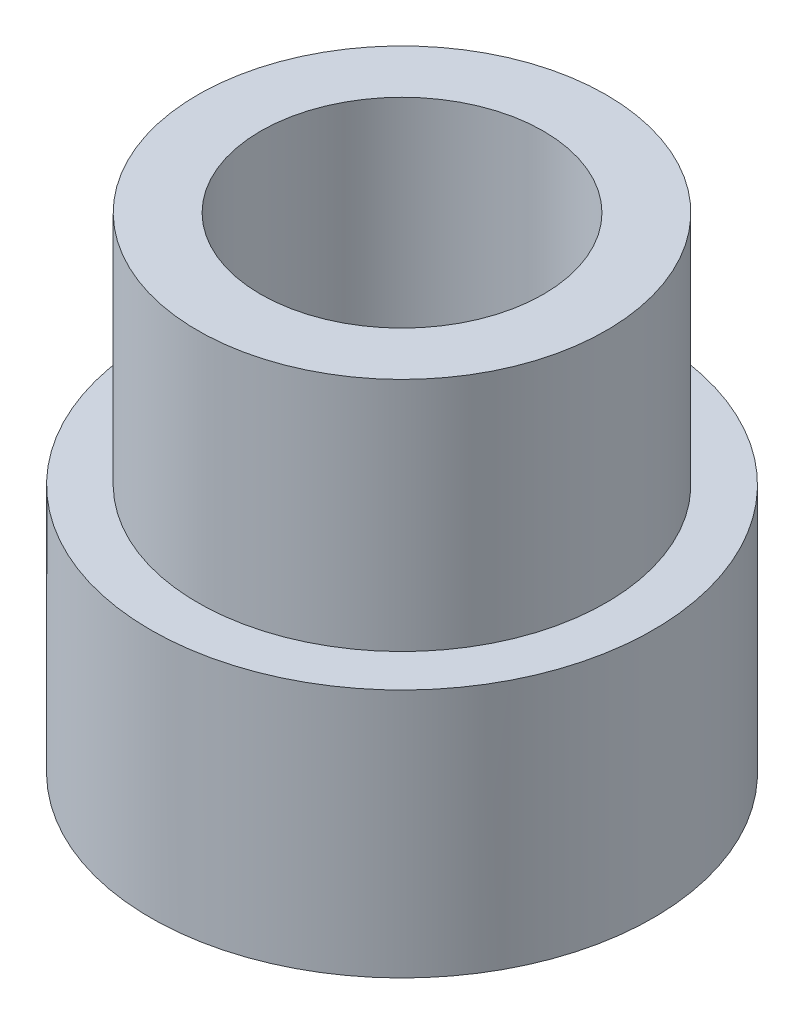
ISO-10303-21;
HEADER;
FILE_DESCRIPTION(('STEP AP214'),'2;1');
FILE_NAME('part.step','',(''),(''),'','','');
FILE_SCHEMA(('AUTOMOTIVE_DESIGN { 1 0 10303 214 1 1 1 1 }'));
ENDSEC;
DATA;
#1=APPLICATION_CONTEXT('core data for automotive mechanical design processes');
#2=APPLICATION_PROTOCOL_DEFINITION('international standard','automotive_design',2000,#1);
#3=PRODUCT_CONTEXT('',#1,'mechanical');
#4=PRODUCT('Part','Part','',(#3));
#5=PRODUCT_RELATED_PRODUCT_CATEGORY('part','',(#4));
#6=PRODUCT_DEFINITION_FORMATION('','',#4);
#7=PRODUCT_DEFINITION_CONTEXT('part definition',#1,'design');
#8=PRODUCT_DEFINITION('design','',#6,#7);
#9=PRODUCT_DEFINITION_SHAPE('','',#8);
#10=(LENGTH_UNIT() NAMED_UNIT(*) SI_UNIT(.MILLI.,.METRE.));
#11=(NAMED_UNIT(*) PLANE_ANGLE_UNIT() SI_UNIT($,.RADIAN.));
#12=(NAMED_UNIT(*) SI_UNIT($,.STERADIAN.) SOLID_ANGLE_UNIT());
#13=UNCERTAINTY_MEASURE_WITH_UNIT(LENGTH_MEASURE(1.E-05),#10,'distance_accuracy_value','');
#14=(GEOMETRIC_REPRESENTATION_CONTEXT(3) GLOBAL_UNCERTAINTY_ASSIGNED_CONTEXT((#13)) GLOBAL_UNIT_ASSIGNED_CONTEXT((#10,
#11,#12)) REPRESENTATION_CONTEXT('',''));
#15=CARTESIAN_POINT('',(0.,0.,0.));
#16=DIRECTION('',(0.,0.,1.));
#17=DIRECTION('',(1.,0.,0.));
#18=AXIS2_PLACEMENT_3D('',#15,#16,#17);
#19=CARTESIAN_POINT('',(0.,10.,0.));
#20=DIRECTION('',(0.,-1.,0.));
#21=DIRECTION('',(0.,0.,-1.));
#22=AXIS2_PLACEMENT_3D('',#19,#20,#21);
#23=CYLINDRICAL_SURFACE('',#22,4.6355);
#24=CARTESIAN_POINT('',(0.,-2.,0.));
#25=DIRECTION('',(0.,1.,0.));
#26=DIRECTION('',(0.,0.,1.));
#27=AXIS2_PLACEMENT_3D('',#24,#25,#26);
#28=CIRCLE('',#27,4.6355);
#29=CARTESIAN_POINT('',(0.,-2.,4.6355));
#30=VERTEX_POINT('',#29);
#31=EDGE_CURVE('E50',#30,#30,#28,.T.);
#32=ORIENTED_EDGE('',*,*,#31,.T.);
#33=EDGE_LOOP('',(#32));
#34=FACE_BOUND('',#33,.T.);
#35=CARTESIAN_POINT('',(0.,-2.91,0.));
#36=DIRECTION('',(0.,-1.,0.));
#37=DIRECTION('',(0.,0.,-1.));
#38=AXIS2_PLACEMENT_3D('',#35,#36,#37);
#39=CIRCLE('',#38,4.6355);
#40=CARTESIAN_POINT('',(0.,-2.91,-4.6355));
#41=VERTEX_POINT('',#40);
#42=EDGE_CURVE('E37',#41,#41,#39,.T.);
#43=ORIENTED_EDGE('',*,*,#42,.T.);
#44=EDGE_LOOP('',(#43));
#45=FACE_BOUND('',#44,.T.);
#46=ADVANCED_FACE('F33',(#34,#45),#23,.F.);
#47=CARTESIAN_POINT('',(0.,10.,0.));
#48=DIRECTION('',(0.,1.,0.));
#49=DIRECTION('',(0.,0.,1.));
#50=AXIS2_PLACEMENT_3D('',#47,#48,#49);
#51=PLANE('',#50);
#52=CARTESIAN_POINT('',(0.,10.,0.));
#53=DIRECTION('',(0.,1.,0.));
#54=DIRECTION('',(0.,0.,1.));
#55=AXIS2_PLACEMENT_3D('',#52,#53,#54);
#56=CIRCLE('',#55,16.51);
#57=CARTESIAN_POINT('',(0.,10.,-16.51));
#58=VERTEX_POINT('',#57);
#59=EDGE_CURVE('E10',#58,#58,#56,.T.);
#60=ORIENTED_EDGE('',*,*,#59,.F.);
#61=EDGE_LOOP('',(#60));
#62=FACE_BOUND('',#61,.T.);
#63=CARTESIAN_POINT('',(0.,10.,0.));
#64=DIRECTION('',(0.,1.,0.));
#65=DIRECTION('',(0.,0.,1.));
#66=AXIS2_PLACEMENT_3D('',#63,#64,#65);
#67=CIRCLE('',#66,20.32);
#68=CARTESIAN_POINT('',(0.,10.,20.32));
#69=VERTEX_POINT('',#68);
#70=EDGE_CURVE('E41',#69,#69,#67,.T.);
#71=ORIENTED_EDGE('',*,*,#70,.T.);
#72=EDGE_LOOP('',(#71));
#73=FACE_BOUND('',#72,.T.);
#74=ADVANCED_FACE('F90',(#62,#73),#51,.T.);
#75=CARTESIAN_POINT('',(0.,10.,0.));
#76=DIRECTION('',(0.,-1.,0.));
#77=DIRECTION('',(0.,0.,-1.));
#78=AXIS2_PLACEMENT_3D('',#75,#76,#77);
#79=CYLINDRICAL_SURFACE('',#78,20.32);
#80=ORIENTED_EDGE('',*,*,#70,.F.);
#81=EDGE_LOOP('',(#80));
#82=FACE_BOUND('',#81,.T.);
#83=CARTESIAN_POINT('',(0.,-10.16,0.));
#84=DIRECTION('',(0.,-1.,0.));
#85=DIRECTION('',(0.,0.,-1.));
#86=AXIS2_PLACEMENT_3D('',#83,#84,#85);
#87=CIRCLE('',#86,20.32);
#88=CARTESIAN_POINT('',(0.,-10.16,-20.32));
#89=VERTEX_POINT('',#88);
#90=EDGE_CURVE('E52',#89,#89,#87,.T.);
#91=ORIENTED_EDGE('',*,*,#90,.F.);
#92=EDGE_LOOP('',(#91));
#93=FACE_BOUND('',#92,.T.);
#94=ADVANCED_FACE('F35',(#82,#93),#79,.T.);
#95=CARTESIAN_POINT('',(0.,29.05,0.));
#96=DIRECTION('',(0.,1.,0.));
#97=DIRECTION('',(0.,0.,1.));
#98=AXIS2_PLACEMENT_3D('',#95,#96,#97);
#99=PLANE('',#98);
#100=CARTESIAN_POINT('',(0.,29.05,0.));
#101=DIRECTION('',(0.,1.,0.));
#102=DIRECTION('',(0.,0.,1.));
#103=AXIS2_PLACEMENT_3D('',#100,#101,#102);
#104=CIRCLE('',#103,16.51);
#105=CARTESIAN_POINT('',(0.,29.05,-16.51));
#106=VERTEX_POINT('',#105);
#107=EDGE_CURVE('E46',#106,#106,#104,.T.);
#108=ORIENTED_EDGE('',*,*,#107,.T.);
#109=EDGE_LOOP('',(#108));
#110=FACE_BOUND('',#109,.T.);
#111=CARTESIAN_POINT('',(0.,29.05,0.));
#112=DIRECTION('',(0.,1.,0.));
#113=DIRECTION('',(0.,0.,1.));
#114=AXIS2_PLACEMENT_3D('',#111,#112,#113);
#115=CIRCLE('',#114,11.43);
#116=CARTESIAN_POINT('',(0.,29.05,-11.43));
#117=VERTEX_POINT('',#116);
#118=EDGE_CURVE('E57',#117,#117,#115,.T.);
#119=ORIENTED_EDGE('',*,*,#118,.F.);
#120=EDGE_LOOP('',(#119));
#121=FACE_BOUND('',#120,.T.);
#122=ADVANCED_FACE('F74',(#110,#121),#99,.T.);
#123=CARTESIAN_POINT('',(0.,29.05,0.));
#124=DIRECTION('',(0.,-1.,0.));
#125=DIRECTION('',(0.,0.,-1.));
#126=AXIS2_PLACEMENT_3D('',#123,#124,#125);
#127=CYLINDRICAL_SURFACE('',#126,16.51);
#128=CARTESIAN_POINT('',(0.,29.05,-16.51));
#129=CARTESIAN_POINT('',(0.,28.8515625,-16.51));
#130=CARTESIAN_POINT('',(0.,28.653125,-16.51));
#131=CARTESIAN_POINT('',(0.,28.25625,-16.51));
#132=CARTESIAN_POINT('',(0.,28.0578125,-16.51));
#133=CARTESIAN_POINT('',(0.,27.6609375,-16.51));
#134=CARTESIAN_POINT('',(0.,27.4625,-16.51));
#135=CARTESIAN_POINT('',(0.,27.065625,-16.51));
#136=CARTESIAN_POINT('',(0.,26.8671875,-16.51));
#137=CARTESIAN_POINT('',(0.,26.4703125,-16.51));
#138=CARTESIAN_POINT('',(0.,26.271875,-16.51));
#139=CARTESIAN_POINT('',(0.,25.875,-16.51));
#140=CARTESIAN_POINT('',(0.,25.6765625,-16.51));
#141=CARTESIAN_POINT('',(0.,25.2796875,-16.51));
#142=CARTESIAN_POINT('',(0.,25.08125,-16.51));
#143=CARTESIAN_POINT('',(0.,24.684375,-16.51));
#144=CARTESIAN_POINT('',(0.,24.4859375,-16.51));
#145=CARTESIAN_POINT('',(0.,24.0890625,-16.51));
#146=CARTESIAN_POINT('',(0.,23.890625,-16.51));
#147=CARTESIAN_POINT('',(0.,23.49375,-16.51));
#148=CARTESIAN_POINT('',(0.,23.2953125,-16.51));
#149=CARTESIAN_POINT('',(0.,22.8984375,-16.51));
#150=CARTESIAN_POINT('',(0.,22.7,-16.51));
#151=CARTESIAN_POINT('',(0.,22.303125,-16.51));
#152=CARTESIAN_POINT('',(0.,22.1046875,-16.51));
#153=CARTESIAN_POINT('',(0.,21.7078125,-16.51));
#154=CARTESIAN_POINT('',(0.,21.509375,-16.51));
#155=CARTESIAN_POINT('',(0.,21.1125,-16.51));
#156=CARTESIAN_POINT('',(0.,20.9140625,-16.51));
#157=CARTESIAN_POINT('',(0.,20.5171875,-16.51));
#158=CARTESIAN_POINT('',(0.,20.31875,-16.51));
#159=CARTESIAN_POINT('',(0.,19.921875,-16.51));
#160=CARTESIAN_POINT('',(0.,19.7234375,-16.51));
#161=CARTESIAN_POINT('',(0.,19.3265625,-16.51));
#162=CARTESIAN_POINT('',(0.,19.128125,-16.51));
#163=CARTESIAN_POINT('',(0.,18.73125,-16.51));
#164=CARTESIAN_POINT('',(0.,18.5328125,-16.51));
#165=CARTESIAN_POINT('',(0.,18.1359375,-16.51));
#166=CARTESIAN_POINT('',(0.,17.9375,-16.51));
#167=CARTESIAN_POINT('',(0.,17.540625,-16.51));
#168=CARTESIAN_POINT('',(0.,17.3421875,-16.51));
#169=CARTESIAN_POINT('',(0.,16.9453125,-16.51));
#170=CARTESIAN_POINT('',(0.,16.746875,-16.51));
#171=CARTESIAN_POINT('',(0.,16.35,-16.51));
#172=CARTESIAN_POINT('',(0.,16.1515625,-16.51));
#173=CARTESIAN_POINT('',(0.,15.7546875,-16.51));
#174=CARTESIAN_POINT('',(0.,15.55625,-16.51));
#175=CARTESIAN_POINT('',(0.,15.159375,-16.51));
#176=CARTESIAN_POINT('',(0.,14.9609375,-16.51));
#177=CARTESIAN_POINT('',(0.,14.5640625,-16.51));
#178=CARTESIAN_POINT('',(0.,14.365625,-16.51));
#179=CARTESIAN_POINT('',(0.,13.96875,-16.51));
#180=CARTESIAN_POINT('',(0.,13.7703125,-16.51));
#181=CARTESIAN_POINT('',(0.,13.3734375,-16.51));
#182=CARTESIAN_POINT('',(0.,13.175,-16.51));
#183=CARTESIAN_POINT('',(0.,12.778125,-16.51));
#184=CARTESIAN_POINT('',(0.,12.5796875,-16.51));
#185=CARTESIAN_POINT('',(0.,12.1828125,-16.51));
#186=CARTESIAN_POINT('',(0.,11.984375,-16.51));
#187=CARTESIAN_POINT('',(0.,11.5875,-16.51));
#188=CARTESIAN_POINT('',(0.,11.3890625,-16.51));
#189=CARTESIAN_POINT('',(0.,10.9921875,-16.51));
#190=CARTESIAN_POINT('',(0.,10.79375,-16.51));
#191=CARTESIAN_POINT('',(0.,10.396875,-16.51));
#192=CARTESIAN_POINT('',(0.,10.1984375,-16.51));
#193=CARTESIAN_POINT('',(0.,10.,-16.51));
#194=B_SPLINE_CURVE_WITH_KNOTS('',3,(#128,#129,#130,#131,#132,#133,#134,#135,#136,#137,#138,
#139,#140,#141,#142,#143,#144,#145,#146,#147,#148,#149,#150,#151,#152,#153,#154,#155,#156,#157,
#158,#159,#160,#161,#162,#163,#164,#165,#166,#167,#168,#169,#170,#171,#172,#173,#174,#175,#176,
#177,#178,#179,#180,#181,#182,#183,#184,#185,#186,#187,#188,#189,#190,#191,#192,#193),
.UNSPECIFIED.,.F.,.F.,(4,2,2,2,2,2,2,2,2,2,2,2,2,2,2,2,2,2,2,2,2,2,2,2,2,2,2,2,2,2,2,2,4),(0.,
0.595312499999997,1.190625,1.7859375,2.38125,2.9765625,3.571875,4.1671875,4.7625,5.3578125,
5.953125,6.5484375,7.14375,7.7390625,8.33437499999999,8.92968749999999,9.525,10.1203125,
10.715625,11.3109375,11.90625,12.5015625,13.096875,13.6921875,14.2875,14.8828125,15.478125,
16.0734375,16.66875,17.2640625,17.859375,18.4546875,19.05),.UNSPECIFIED.);
#195=EDGE_CURVE('BSEAM77',#106,#58,#194,.T.);
#196=ORIENTED_EDGE('',*,*,#107,.F.);
#197=ORIENTED_EDGE('',*,*,#59,.T.);
#198=ORIENTED_EDGE('',*,*,#195,.T.);
#199=ORIENTED_EDGE('',*,*,#195,.F.);
#200=EDGE_LOOP('',(#196,#198,#197,#199));
#201=FACE_BOUND('',#200,.T.);
#202=ADVANCED_FACE('F77',(#201),#127,.T.);
#203=CARTESIAN_POINT('',(0.,29.05,0.));
#204=DIRECTION('',(0.,-1.,0.));
#205=DIRECTION('',(0.,0.,-1.));
#206=AXIS2_PLACEMENT_3D('',#203,#204,#205);
#207=CYLINDRICAL_SURFACE('',#206,11.43);
#208=CARTESIAN_POINT('',(0.,-2.,0.));
#209=DIRECTION('',(0.,1.,0.));
#210=DIRECTION('',(0.,0.,1.));
#211=AXIS2_PLACEMENT_3D('',#208,#209,#210);
#212=CIRCLE('',#211,11.43);
#213=CARTESIAN_POINT('',(0.,-2.,-11.43));
#214=VERTEX_POINT('',#213);
#215=EDGE_CURVE('E53',#214,#214,#212,.T.);
#216=CARTESIAN_POINT('',(0.,29.05,-11.43));
#217=CARTESIAN_POINT('',(0.,28.7265625,-11.43));
#218=CARTESIAN_POINT('',(0.,28.403125,-11.43));
#219=CARTESIAN_POINT('',(0.,27.75625,-11.43));
#220=CARTESIAN_POINT('',(0.,27.4328125,-11.43));
#221=CARTESIAN_POINT('',(0.,26.7859375,-11.43));
#222=CARTESIAN_POINT('',(0.,26.4625,-11.43));
#223=CARTESIAN_POINT('',(0.,25.815625,-11.43));
#224=CARTESIAN_POINT('',(0.,25.4921875,-11.43));
#225=CARTESIAN_POINT('',(0.,24.8453125,-11.43));
#226=CARTESIAN_POINT('',(0.,24.521875,-11.43));
#227=CARTESIAN_POINT('',(0.,23.875,-11.43));
#228=CARTESIAN_POINT('',(0.,23.5515625,-11.43));
#229=CARTESIAN_POINT('',(0.,22.9046875,-11.43));
#230=CARTESIAN_POINT('',(0.,22.58125,-11.43));
#231=CARTESIAN_POINT('',(0.,21.934375,-11.43));
#232=CARTESIAN_POINT('',(0.,21.6109375,-11.43));
#233=CARTESIAN_POINT('',(0.,20.9640625,-11.43));
#234=CARTESIAN_POINT('',(0.,20.640625,-11.43));
#235=CARTESIAN_POINT('',(0.,19.99375,-11.43));
#236=CARTESIAN_POINT('',(0.,19.6703125,-11.43));
#237=CARTESIAN_POINT('',(0.,19.0234375,-11.43));
#238=CARTESIAN_POINT('',(0.,18.7,-11.43));
#239=CARTESIAN_POINT('',(0.,18.053125,-11.43));
#240=CARTESIAN_POINT('',(0.,17.7296875,-11.43));
#241=CARTESIAN_POINT('',(0.,17.0828125,-11.43));
#242=CARTESIAN_POINT('',(0.,16.759375,-11.43));
#243=CARTESIAN_POINT('',(0.,16.1125,-11.43));
#244=CARTESIAN_POINT('',(0.,15.7890625,-11.43));
#245=CARTESIAN_POINT('',(0.,15.1421875,-11.43));
#246=CARTESIAN_POINT('',(0.,14.81875,-11.43));
#247=CARTESIAN_POINT('',(0.,14.171875,-11.43));
#248=CARTESIAN_POINT('',(0.,13.8484375,-11.43));
#249=CARTESIAN_POINT('',(0.,13.2015625,-11.43));
#250=CARTESIAN_POINT('',(0.,12.878125,-11.43));
#251=CARTESIAN_POINT('',(0.,12.23125,-11.43));
#252=CARTESIAN_POINT('',(0.,11.9078125,-11.43));
#253=CARTESIAN_POINT('',(0.,11.2609375,-11.43));
#254=CARTESIAN_POINT('',(0.,10.9375,-11.43));
#255=CARTESIAN_POINT('',(0.,10.290625,-11.43));
#256=CARTESIAN_POINT('',(0.,9.9671875,-11.43));
#257=CARTESIAN_POINT('',(0.,9.3203125,-11.43));
#258=CARTESIAN_POINT('',(0.,8.996875,-11.43));
#259=CARTESIAN_POINT('',(0.,8.35,-11.43));
#260=CARTESIAN_POINT('',(0.,8.0265625,-11.43));
#261=CARTESIAN_POINT('',(0.,7.3796875,-11.43));
#262=CARTESIAN_POINT('',(0.,7.05625,-11.43));
#263=CARTESIAN_POINT('',(0.,6.409375,-11.43));
#264=CARTESIAN_POINT('',(0.,6.0859375,-11.43));
#265=CARTESIAN_POINT('',(0.,5.4390625,-11.43));
#266=CARTESIAN_POINT('',(0.,5.115625,-11.43));
#267=CARTESIAN_POINT('',(0.,4.46875,-11.43));
#268=CARTESIAN_POINT('',(0.,4.1453125,-11.43));
#269=CARTESIAN_POINT('',(0.,3.4984375,-11.43));
#270=CARTESIAN_POINT('',(0.,3.175,-11.43));
#271=CARTESIAN_POINT('',(0.,2.528125,-11.43));
#272=CARTESIAN_POINT('',(0.,2.2046875,-11.43));
#273=CARTESIAN_POINT('',(0.,1.5578125,-11.43));
#274=CARTESIAN_POINT('',(0.,1.234375,-11.43));
#275=CARTESIAN_POINT('',(0.,0.587500000000001,-11.43));
#276=CARTESIAN_POINT('',(0.,0.264062500000002,-11.43));
#277=CARTESIAN_POINT('',(0.,-0.382812499999997,-11.43));
#278=CARTESIAN_POINT('',(0.,-0.706249999999997,-11.43));
#279=CARTESIAN_POINT('',(0.,-1.353125,-11.43));
#280=CARTESIAN_POINT('',(0.,-1.6765625,-11.43));
#281=CARTESIAN_POINT('',(0.,-2.,-11.43));
#282=B_SPLINE_CURVE_WITH_KNOTS('',3,(#216,#217,#218,#219,#220,#221,#222,#223,#224,#225,#226,
#227,#228,#229,#230,#231,#232,#233,#234,#235,#236,#237,#238,#239,#240,#241,#242,#243,#244,#245,
#246,#247,#248,#249,#250,#251,#252,#253,#254,#255,#256,#257,#258,#259,#260,#261,#262,#263,#264,
#265,#266,#267,#268,#269,#270,#271,#272,#273,#274,#275,#276,#277,#278,#279,#280,#281),
.UNSPECIFIED.,.F.,.F.,(4,2,2,2,2,2,2,2,2,2,2,2,2,2,2,2,2,2,2,2,2,2,2,2,2,2,2,2,2,2,2,2,4),(0.,
0.970312500000001,1.940625,2.9109375,3.88125,4.8515625,5.821875,6.7921875,7.7625,8.7328125,
9.703125,10.6734375,11.64375,12.6140625,13.584375,14.5546875,15.525,16.4953125,17.465625,
18.4359375,19.40625,20.3765625,21.346875,22.3171875,23.2875,24.2578125,25.228125,26.1984375,
27.16875,28.1390625,29.109375,30.0796875,31.05),.UNSPECIFIED.);
#283=EDGE_CURVE('BSEAM79',#117,#214,#282,.T.);
#284=ORIENTED_EDGE('',*,*,#118,.T.);
#285=ORIENTED_EDGE('',*,*,#215,.F.);
#286=ORIENTED_EDGE('',*,*,#283,.T.);
#287=ORIENTED_EDGE('',*,*,#283,.F.);
#288=EDGE_LOOP('',(#284,#286,#285,#287));
#289=FACE_BOUND('',#288,.T.);
#290=ADVANCED_FACE('F79',(#289),#207,.F.);
#291=CARTESIAN_POINT('',(0.,-10.16,0.));
#292=DIRECTION('',(0.,-1.,0.));
#293=DIRECTION('',(0.,0.,-1.));
#294=AXIS2_PLACEMENT_3D('',#291,#292,#293);
#295=PLANE('',#294);
#296=CARTESIAN_POINT('',(0.,-10.16,0.));
#297=DIRECTION('',(0.,-1.,0.));
#298=DIRECTION('',(0.,0.,-1.));
#299=AXIS2_PLACEMENT_3D('',#296,#297,#298);
#300=CIRCLE('',#299,11.25);
#301=CARTESIAN_POINT('',(0.,-10.16,-11.25));
#302=VERTEX_POINT('',#301);
#303=EDGE_CURVE('E65',#302,#302,#300,.T.);
#304=ORIENTED_EDGE('',*,*,#303,.F.);
#305=EDGE_LOOP('',(#304));
#306=FACE_BOUND('',#305,.T.);
#307=ORIENTED_EDGE('',*,*,#90,.T.);
#308=EDGE_LOOP('',(#307));
#309=FACE_BOUND('',#308,.T.);
#310=ADVANCED_FACE('F85',(#306,#309),#295,.T.);
#311=CARTESIAN_POINT('',(0.,-2.,0.));
#312=DIRECTION('',(0.,1.,0.));
#313=DIRECTION('',(0.,0.,1.));
#314=AXIS2_PLACEMENT_3D('',#311,#312,#313);
#315=PLANE('',#314);
#316=ORIENTED_EDGE('',*,*,#31,.F.);
#317=EDGE_LOOP('',(#316));
#318=FACE_BOUND('',#317,.T.);
#319=ORIENTED_EDGE('',*,*,#215,.T.);
#320=EDGE_LOOP('',(#319));
#321=FACE_BOUND('',#320,.T.);
#322=ADVANCED_FACE('F121',(#318,#321),#315,.T.);
#323=CARTESIAN_POINT('',(0.,-3.66,0.));
#324=DIRECTION('',(0.,-1.,0.));
#325=DIRECTION('',(0.,0.,-1.));
#326=AXIS2_PLACEMENT_3D('',#323,#324,#325);
#327=CYLINDRICAL_SURFACE('',#326,11.25);
#328=CARTESIAN_POINT('',(0.,-3.66,0.));
#329=DIRECTION('',(0.,-1.,0.));
#330=DIRECTION('',(0.,0.,-1.));
#331=AXIS2_PLACEMENT_3D('',#328,#329,#330);
#332=CIRCLE('',#331,11.25);
#333=CARTESIAN_POINT('',(0.,-3.66,-11.25));
#334=VERTEX_POINT('',#333);
#335=EDGE_CURVE('E60',#334,#334,#332,.T.);
#336=CARTESIAN_POINT('',(0.,-3.66,-11.25));
#337=CARTESIAN_POINT('',(0.,-3.72770833333333,-11.25));
#338=CARTESIAN_POINT('',(0.,-3.79541666666667,-11.25));
#339=CARTESIAN_POINT('',(0.,-3.93083333333333,-11.25));
#340=CARTESIAN_POINT('',(0.,-3.99854166666667,-11.25));
#341=CARTESIAN_POINT('',(0.,-4.13395833333333,-11.25));
#342=CARTESIAN_POINT('',(0.,-4.20166666666667,-11.25));
#343=CARTESIAN_POINT('',(0.,-4.33708333333333,-11.25));
#344=CARTESIAN_POINT('',(0.,-4.40479166666667,-11.25));
#345=CARTESIAN_POINT('',(0.,-4.54020833333333,-11.25));
#346=CARTESIAN_POINT('',(0.,-4.60791666666667,-11.25));
#347=CARTESIAN_POINT('',(0.,-4.74333333333333,-11.25));
#348=CARTESIAN_POINT('',(0.,-4.81104166666667,-11.25));
#349=CARTESIAN_POINT('',(0.,-4.94645833333333,-11.25));
#350=CARTESIAN_POINT('',(0.,-5.01416666666667,-11.25));
#351=CARTESIAN_POINT('',(0.,-5.14958333333333,-11.25));
#352=CARTESIAN_POINT('',(0.,-5.21729166666667,-11.25));
#353=CARTESIAN_POINT('',(0.,-5.35270833333333,-11.25));
#354=CARTESIAN_POINT('',(0.,-5.42041666666667,-11.25));
#355=CARTESIAN_POINT('',(0.,-5.55583333333333,-11.25));
#356=CARTESIAN_POINT('',(0.,-5.62354166666667,-11.25));
#357=CARTESIAN_POINT('',(0.,-5.75895833333333,-11.25));
#358=CARTESIAN_POINT('',(0.,-5.82666666666667,-11.25));
#359=CARTESIAN_POINT('',(0.,-5.96208333333333,-11.25));
#360=CARTESIAN_POINT('',(0.,-6.02979166666667,-11.25));
#361=CARTESIAN_POINT('',(0.,-6.16520833333333,-11.25));
#362=CARTESIAN_POINT('',(0.,-6.23291666666667,-11.25));
#363=CARTESIAN_POINT('',(0.,-6.36833333333333,-11.25));
#364=CARTESIAN_POINT('',(0.,-6.43604166666667,-11.25));
#365=CARTESIAN_POINT('',(0.,-6.57145833333333,-11.25));
#366=CARTESIAN_POINT('',(0.,-6.63916666666667,-11.25));
#367=CARTESIAN_POINT('',(0.,-6.77458333333333,-11.25));
#368=CARTESIAN_POINT('',(0.,-6.84229166666667,-11.25));
#369=CARTESIAN_POINT('',(0.,-6.97770833333333,-11.25));
#370=CARTESIAN_POINT('',(0.,-7.04541666666667,-11.25));
#371=CARTESIAN_POINT('',(0.,-7.18083333333333,-11.25));
#372=CARTESIAN_POINT('',(0.,-7.24854166666667,-11.25));
#373=CARTESIAN_POINT('',(0.,-7.38395833333333,-11.25));
#374=CARTESIAN_POINT('',(0.,-7.45166666666667,-11.25));
#375=CARTESIAN_POINT('',(0.,-7.58708333333333,-11.25));
#376=CARTESIAN_POINT('',(0.,-7.65479166666667,-11.25));
#377=CARTESIAN_POINT('',(0.,-7.79020833333333,-11.25));
#378=CARTESIAN_POINT('',(0.,-7.85791666666667,-11.25));
#379=CARTESIAN_POINT('',(0.,-7.99333333333333,-11.25));
#380=CARTESIAN_POINT('',(0.,-8.06104166666667,-11.25));
#381=CARTESIAN_POINT('',(0.,-8.19645833333333,-11.25));
#382=CARTESIAN_POINT('',(0.,-8.26416666666667,-11.25));
#383=CARTESIAN_POINT('',(0.,-8.39958333333333,-11.25));
#384=CARTESIAN_POINT('',(0.,-8.46729166666667,-11.25));
#385=CARTESIAN_POINT('',(0.,-8.60270833333333,-11.25));
#386=CARTESIAN_POINT('',(0.,-8.67041666666667,-11.25));
#387=CARTESIAN_POINT('',(0.,-8.80583333333333,-11.25));
#388=CARTESIAN_POINT('',(0.,-8.87354166666667,-11.25));
#389=CARTESIAN_POINT('',(0.,-9.00895833333333,-11.25));
#390=CARTESIAN_POINT('',(0.,-9.07666666666667,-11.25));
#391=CARTESIAN_POINT('',(0.,-9.21208333333333,-11.25));
#392=CARTESIAN_POINT('',(0.,-9.27979166666667,-11.25));
#393=CARTESIAN_POINT('',(0.,-9.41520833333333,-11.25));
#394=CARTESIAN_POINT('',(0.,-9.48291666666667,-11.25));
#395=CARTESIAN_POINT('',(0.,-9.61833333333333,-11.25));
#396=CARTESIAN_POINT('',(0.,-9.68604166666667,-11.25));
#397=CARTESIAN_POINT('',(0.,-9.82145833333333,-11.25));
#398=CARTESIAN_POINT('',(0.,-9.88916666666667,-11.25));
#399=CARTESIAN_POINT('',(0.,-10.0245833333333,-11.25));
#400=CARTESIAN_POINT('',(0.,-10.0922916666667,-11.25));
#401=CARTESIAN_POINT('',(0.,-10.16,-11.25));
#402=B_SPLINE_CURVE_WITH_KNOTS('',3,(#336,#337,#338,#339,#340,#341,#342,#343,#344,#345,#346,
#347,#348,#349,#350,#351,#352,#353,#354,#355,#356,#357,#358,#359,#360,#361,#362,#363,#364,#365,
#366,#367,#368,#369,#370,#371,#372,#373,#374,#375,#376,#377,#378,#379,#380,#381,#382,#383,#384,
#385,#386,#387,#388,#389,#390,#391,#392,#393,#394,#395,#396,#397,#398,#399,#400,#401),
.UNSPECIFIED.,.F.,.F.,(4,2,2,2,2,2,2,2,2,2,2,2,2,2,2,2,2,2,2,2,2,2,2,2,2,2,2,2,2,2,2,2,4),(0.,
0.203125,0.40625,0.609375,0.8125,1.015625,1.21875,1.421875,1.625,1.828125,2.03125,2.234375,
2.4375,2.640625,2.84375,3.046875,3.25,3.453125,3.65625,3.859375,4.0625,4.265625,4.46875,
4.671875,4.875,5.078125,5.28125,5.484375,5.6875,5.890625,6.09375,6.296875,6.5),.UNSPECIFIED.);
#403=EDGE_CURVE('BSEAM115',#334,#302,#402,.T.);
#404=ORIENTED_EDGE('',*,*,#335,.F.);
#405=ORIENTED_EDGE('',*,*,#303,.T.);
#406=ORIENTED_EDGE('',*,*,#403,.T.);
#407=ORIENTED_EDGE('',*,*,#403,.F.);
#408=EDGE_LOOP('',(#404,#406,#405,#407));
#409=FACE_BOUND('',#408,.T.);
#410=ADVANCED_FACE('F115',(#409),#327,.F.);
#411=CARTESIAN_POINT('',(0.,-3.66,0.));
#412=DIRECTION('',(0.,-1.,0.));
#413=DIRECTION('',(0.,0.,-1.));
#414=AXIS2_PLACEMENT_3D('',#411,#412,#413);
#415=PLANE('',#414);
#416=CARTESIAN_POINT('',(0.,-3.66,0.));
#417=DIRECTION('',(0.,-1.,0.));
#418=DIRECTION('',(0.,0.,-1.));
#419=AXIS2_PLACEMENT_3D('',#416,#417,#418);
#420=CIRCLE('',#419,8.5);
#421=CARTESIAN_POINT('',(0.,-3.66,-8.5));
#422=VERTEX_POINT('',#421);
#423=EDGE_CURVE('E102',#422,#422,#420,.T.);
#424=ORIENTED_EDGE('',*,*,#423,.F.);
#425=EDGE_LOOP('',(#424));
#426=FACE_BOUND('',#425,.T.);
#427=ORIENTED_EDGE('',*,*,#335,.T.);
#428=EDGE_LOOP('',(#427));
#429=FACE_BOUND('',#428,.T.);
#430=ADVANCED_FACE('F112',(#426,#429),#415,.T.);
#431=CARTESIAN_POINT('',(0.,-2.91,0.));
#432=DIRECTION('',(0.,-1.,0.));
#433=DIRECTION('',(0.,0.,-1.));
#434=AXIS2_PLACEMENT_3D('',#431,#432,#433);
#435=CYLINDRICAL_SURFACE('',#434,8.5);
#436=CARTESIAN_POINT('',(0.,-2.91,0.));
#437=DIRECTION('',(0.,-1.,0.));
#438=DIRECTION('',(0.,0.,-1.));
#439=AXIS2_PLACEMENT_3D('',#436,#437,#438);
#440=CIRCLE('',#439,8.5);
#441=CARTESIAN_POINT('',(0.,-2.91,-8.5));
#442=VERTEX_POINT('',#441);
#443=EDGE_CURVE('E99',#442,#442,#440,.T.);
#444=ORIENTED_EDGE('',*,*,#443,.F.);
#445=EDGE_LOOP('',(#444));
#446=FACE_BOUND('',#445,.T.);
#447=ORIENTED_EDGE('',*,*,#423,.T.);
#448=EDGE_LOOP('',(#447));
#449=FACE_BOUND('',#448,.T.);
#450=ADVANCED_FACE('F110',(#446,#449),#435,.F.);
#451=CARTESIAN_POINT('',(0.,-2.91,0.));
#452=DIRECTION('',(0.,-1.,0.));
#453=DIRECTION('',(0.,0.,-1.));
#454=AXIS2_PLACEMENT_3D('',#451,#452,#453);
#455=PLANE('',#454);
#456=ORIENTED_EDGE('',*,*,#42,.F.);
#457=EDGE_LOOP('',(#456));
#458=FACE_BOUND('',#457,.T.);
#459=ORIENTED_EDGE('',*,*,#443,.T.);
#460=EDGE_LOOP('',(#459));
#461=FACE_BOUND('',#460,.T.);
#462=ADVANCED_FACE('F196',(#458,#461),#455,.T.);
#463=CLOSED_SHELL('',(#46,#74,#94,#122,#202,#290,#310,#322,#410,#430,#450,#462));
#464=MANIFOLD_SOLID_BREP('B2',#463);
#465=ADVANCED_BREP_SHAPE_REPRESENTATION('',(#18,#464),#14);
#466=SHAPE_DEFINITION_REPRESENTATION(#9,#465);
ENDSEC;
END-ISO-10303-21;
